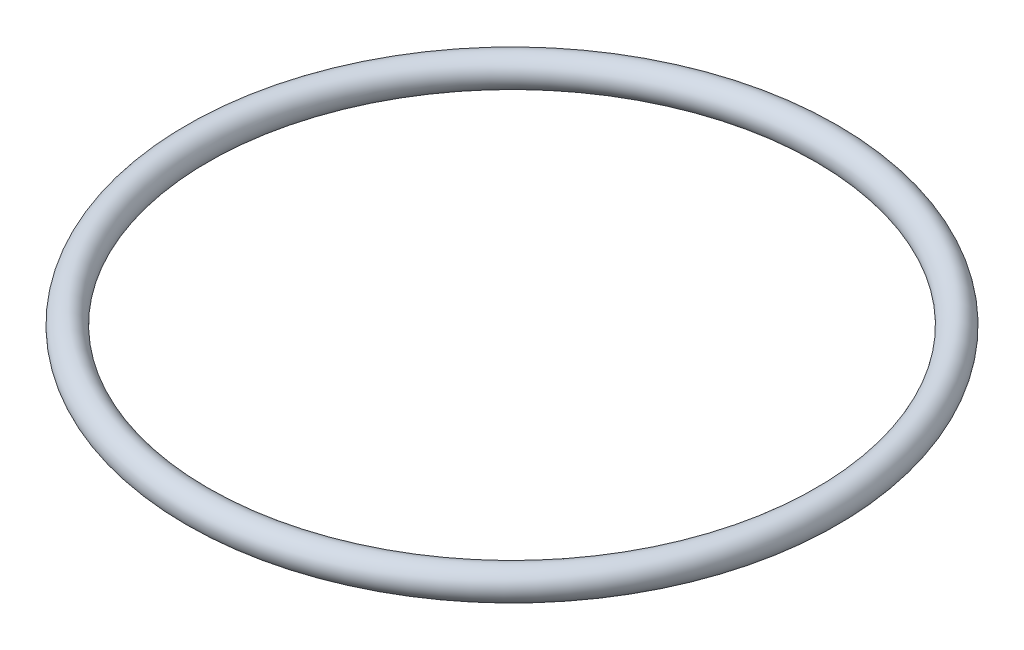
ISO-10303-21;
HEADER;
FILE_DESCRIPTION(('STEP AP214'),'2;1');
FILE_NAME('part.step','',(''),(''),'','','');
FILE_SCHEMA(('AUTOMOTIVE_DESIGN { 1 0 10303 214 1 1 1 1 }'));
ENDSEC;
DATA;
#1=APPLICATION_CONTEXT('core data for automotive mechanical design processes');
#2=APPLICATION_PROTOCOL_DEFINITION('international standard','automotive_design',2000,#1);
#3=PRODUCT_CONTEXT('',#1,'mechanical');
#4=PRODUCT('Part','Part','',(#3));
#5=PRODUCT_RELATED_PRODUCT_CATEGORY('part','',(#4));
#6=PRODUCT_DEFINITION_FORMATION('','',#4);
#7=PRODUCT_DEFINITION_CONTEXT('part definition',#1,'design');
#8=PRODUCT_DEFINITION('design','',#6,#7);
#9=PRODUCT_DEFINITION_SHAPE('','',#8);
#10=(LENGTH_UNIT() NAMED_UNIT(*) SI_UNIT(.MILLI.,.METRE.));
#11=(NAMED_UNIT(*) PLANE_ANGLE_UNIT() SI_UNIT($,.RADIAN.));
#12=(NAMED_UNIT(*) SI_UNIT($,.STERADIAN.) SOLID_ANGLE_UNIT());
#13=UNCERTAINTY_MEASURE_WITH_UNIT(LENGTH_MEASURE(1.E-05),#10,'distance_accuracy_value','');
#14=(GEOMETRIC_REPRESENTATION_CONTEXT(3) GLOBAL_UNCERTAINTY_ASSIGNED_CONTEXT((#13)) GLOBAL_UNIT_ASSIGNED_CONTEXT((#10,
#11,#12)) REPRESENTATION_CONTEXT('',''));
#15=CARTESIAN_POINT('',(0.,0.,0.));
#16=DIRECTION('',(0.,0.,1.));
#17=DIRECTION('',(1.,0.,0.));
#18=AXIS2_PLACEMENT_3D('',#15,#16,#17);
#19=CARTESIAN_POINT('',(0.,0.,27.345));
#20=DIRECTION('',(0.,1.,0.));
#21=DIRECTION('',(0.,0.,1.));
#22=AXIS2_PLACEMENT_3D('',#19,#20,#21);
#23=TOROIDAL_SURFACE('',#22,27.345,1.31);
#24=CARTESIAN_POINT('',(0.,0.,56.));
#25=VERTEX_POINT('',#24);
#26=VERTEX_LOOP('',#25);
#27=FACE_BOUND('',#26,.T.);
#28=ADVANCED_FACE('F28',(#27),#23,.T.);
#29=CLOSED_SHELL('',(#28));
#30=MANIFOLD_SOLID_BREP('B2',#29);
#31=ADVANCED_BREP_SHAPE_REPRESENTATION('',(#18,#30),#14);
#32=SHAPE_DEFINITION_REPRESENTATION(#9,#31);
ENDSEC;
END-ISO-10303-21;
